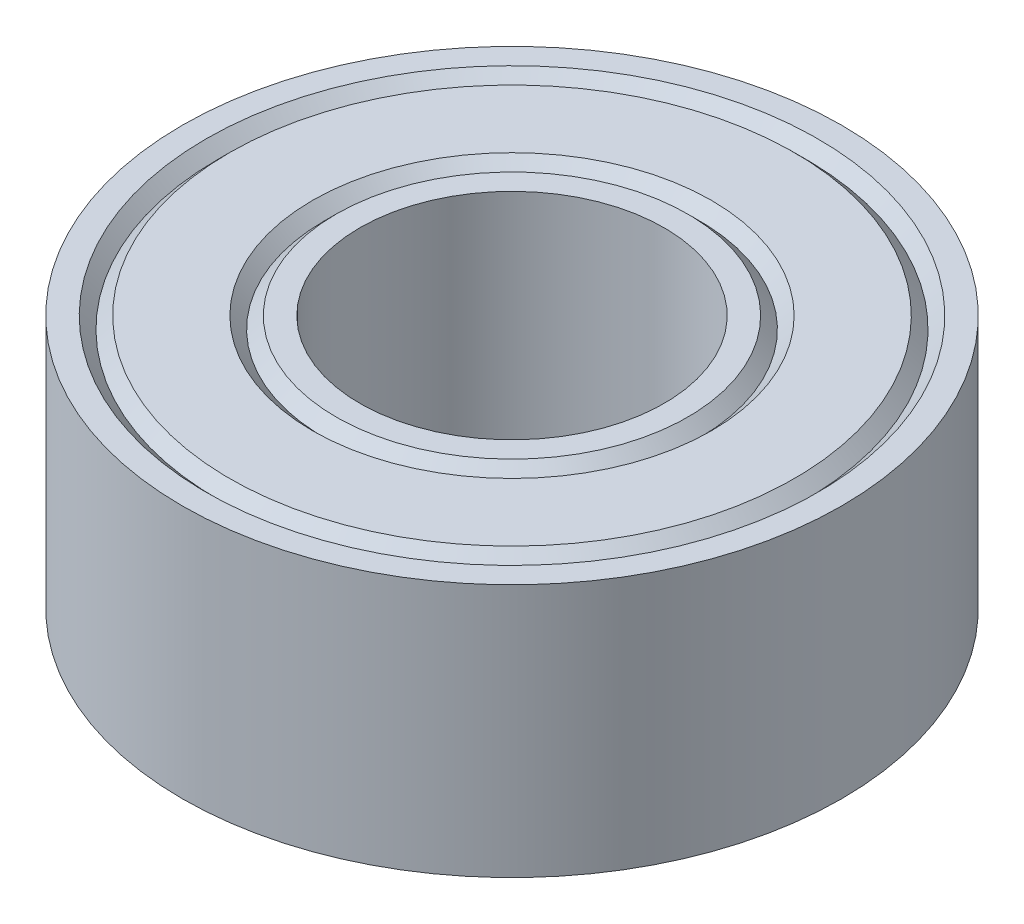
ISO-10303-21;
HEADER;
FILE_DESCRIPTION(('STEP AP214'),'2;1');
FILE_NAME('part.step','',(''),(''),'','','');
FILE_SCHEMA(('AUTOMOTIVE_DESIGN { 1 0 10303 214 1 1 1 1 }'));
ENDSEC;
DATA;
#1=APPLICATION_CONTEXT('core data for automotive mechanical design processes');
#2=APPLICATION_PROTOCOL_DEFINITION('international standard','automotive_design',2000,#1);
#3=PRODUCT_CONTEXT('',#1,'mechanical');
#4=PRODUCT('Part','Part','',(#3));
#5=PRODUCT_RELATED_PRODUCT_CATEGORY('part','',(#4));
#6=PRODUCT_DEFINITION_FORMATION('','',#4);
#7=PRODUCT_DEFINITION_CONTEXT('part definition',#1,'design');
#8=PRODUCT_DEFINITION('design','',#6,#7);
#9=PRODUCT_DEFINITION_SHAPE('','',#8);
#10=(LENGTH_UNIT() NAMED_UNIT(*) SI_UNIT(.MILLI.,.METRE.));
#11=(NAMED_UNIT(*) PLANE_ANGLE_UNIT() SI_UNIT($,.RADIAN.));
#12=(NAMED_UNIT(*) SI_UNIT($,.STERADIAN.) SOLID_ANGLE_UNIT());
#13=UNCERTAINTY_MEASURE_WITH_UNIT(LENGTH_MEASURE(1.E-05),#10,'distance_accuracy_value','');
#14=(GEOMETRIC_REPRESENTATION_CONTEXT(3) GLOBAL_UNCERTAINTY_ASSIGNED_CONTEXT((#13)) GLOBAL_UNIT_ASSIGNED_CONTEXT((#10,
#11,#12)) REPRESENTATION_CONTEXT('',''));
#15=CARTESIAN_POINT('',(0.,0.,0.));
#16=DIRECTION('',(0.,0.,1.));
#17=DIRECTION('',(1.,0.,0.));
#18=AXIS2_PLACEMENT_3D('',#15,#16,#17);
#19=CARTESIAN_POINT('',(0.,2.5,0.));
#20=DIRECTION('',(0.,1.,0.));
#21=DIRECTION('',(-1.,0.,0.));
#22=AXIS2_PLACEMENT_3D('',#19,#20,#21);
#23=CYLINDRICAL_SURFACE('',#22,3.);
#24=CARTESIAN_POINT('',(0.,2.5,0.));
#25=DIRECTION('',(0.,1.,0.));
#26=DIRECTION('',(-1.,0.,0.));
#27=AXIS2_PLACEMENT_3D('',#24,#25,#26);
#28=CIRCLE('',#27,3.);
#29=CARTESIAN_POINT('',(-3.,2.5,0.));
#30=VERTEX_POINT('',#29);
#31=EDGE_CURVE('E83',#30,#30,#28,.T.);
#32=ORIENTED_EDGE('',*,*,#31,.T.);
#33=EDGE_LOOP('',(#32));
#34=FACE_BOUND('',#33,.T.);
#35=CARTESIAN_POINT('',(0.,-2.5,0.));
#36=DIRECTION('',(0.,1.,0.));
#37=DIRECTION('',(-1.,0.,0.));
#38=AXIS2_PLACEMENT_3D('',#35,#36,#37);
#39=CIRCLE('',#38,3.00000000000001);
#40=CARTESIAN_POINT('',(-3.,-2.5,0.));
#41=VERTEX_POINT('',#40);
#42=EDGE_CURVE('E10',#41,#41,#39,.T.);
#43=ORIENTED_EDGE('',*,*,#42,.F.);
#44=EDGE_LOOP('',(#43));
#45=FACE_BOUND('',#44,.T.);
#46=ADVANCED_FACE('F31',(#34,#45),#23,.F.);
#47=CARTESIAN_POINT('',(-3.,-2.5,0.));
#48=DIRECTION('',(0.,-1.,0.));
#49=DIRECTION('',(1.,0.,0.));
#50=AXIS2_PLACEMENT_3D('',#47,#48,#49);
#51=PLANE('',#50);
#52=ORIENTED_EDGE('',*,*,#42,.T.);
#53=EDGE_LOOP('',(#52));
#54=FACE_BOUND('',#53,.T.);
#55=CARTESIAN_POINT('',(0.,-2.5,0.));
#56=DIRECTION('',(0.,1.,0.));
#57=DIRECTION('',(-1.,0.,0.));
#58=AXIS2_PLACEMENT_3D('',#55,#56,#57);
#59=CIRCLE('',#58,3.46666666666667);
#60=CARTESIAN_POINT('',(-3.46666666666667,-2.5,0.));
#61=VERTEX_POINT('',#60);
#62=EDGE_CURVE('E37',#61,#61,#59,.T.);
#63=ORIENTED_EDGE('',*,*,#62,.F.);
#64=EDGE_LOOP('',(#63));
#65=FACE_BOUND('',#64,.T.);
#66=ADVANCED_FACE('F101',(#54,#65),#51,.T.);
#67=CARTESIAN_POINT('',(0.,-2.26666666666667,0.));
#68=DIRECTION('',(0.,1.,0.));
#69=DIRECTION('',(-1.,0.,0.));
#70=AXIS2_PLACEMENT_3D('',#67,#68,#69);
#71=CONICAL_SURFACE('',#70,3.70000000000001,0.785398163397456);
#72=ORIENTED_EDGE('',*,*,#62,.T.);
#73=EDGE_LOOP('',(#72));
#74=FACE_BOUND('',#73,.T.);
#75=CARTESIAN_POINT('',(0.,-2.26666666666667,0.));
#76=DIRECTION('',(0.,1.,0.));
#77=DIRECTION('',(-1.,0.,0.));
#78=AXIS2_PLACEMENT_3D('',#75,#76,#77);
#79=CIRCLE('',#78,3.70000000000001);
#80=CARTESIAN_POINT('',(-3.7,-2.26666666666667,0.));
#81=VERTEX_POINT('',#80);
#82=EDGE_CURVE('E41',#81,#81,#79,.T.);
#83=ORIENTED_EDGE('',*,*,#82,.F.);
#84=EDGE_LOOP('',(#83));
#85=FACE_BOUND('',#84,.T.);
#86=ADVANCED_FACE('F105',(#74,#85),#71,.T.);
#87=CARTESIAN_POINT('',(0.,-2.5,0.));
#88=DIRECTION('',(0.,-1.,0.));
#89=DIRECTION('',(1.,0.,0.));
#90=AXIS2_PLACEMENT_3D('',#87,#88,#89);
#91=CONICAL_SURFACE('',#90,3.93333333333334,0.785398163397449);
#92=ORIENTED_EDGE('',*,*,#82,.T.);
#93=EDGE_LOOP('',(#92));
#94=FACE_BOUND('',#93,.T.);
#95=CARTESIAN_POINT('',(0.,-2.5,0.));
#96=DIRECTION('',(0.,1.,0.));
#97=DIRECTION('',(-1.,0.,0.));
#98=AXIS2_PLACEMENT_3D('',#95,#96,#97);
#99=CIRCLE('',#98,3.93333333333334);
#100=CARTESIAN_POINT('',(-3.93333333333333,-2.5,0.));
#101=VERTEX_POINT('',#100);
#102=EDGE_CURVE('E45',#101,#101,#99,.T.);
#103=ORIENTED_EDGE('',*,*,#102,.F.);
#104=EDGE_LOOP('',(#103));
#105=FACE_BOUND('',#104,.T.);
#106=ADVANCED_FACE('F109',(#94,#105),#91,.F.);
#107=CARTESIAN_POINT('',(-3.93333333333333,-2.5,0.));
#108=DIRECTION('',(0.,-1.,0.));
#109=DIRECTION('',(1.,0.,0.));
#110=AXIS2_PLACEMENT_3D('',#107,#108,#109);
#111=PLANE('',#110);
#112=ORIENTED_EDGE('',*,*,#102,.T.);
#113=EDGE_LOOP('',(#112));
#114=FACE_BOUND('',#113,.T.);
#115=CARTESIAN_POINT('',(0.,-2.5,0.));
#116=DIRECTION('',(0.,1.,0.));
#117=DIRECTION('',(-1.,0.,0.));
#118=AXIS2_PLACEMENT_3D('',#115,#116,#117);
#119=CIRCLE('',#118,5.56666666666668);
#120=CARTESIAN_POINT('',(-5.56666666666667,-2.5,0.));
#121=VERTEX_POINT('',#120);
#122=EDGE_CURVE('E50',#121,#121,#119,.T.);
#123=ORIENTED_EDGE('',*,*,#122,.F.);
#124=EDGE_LOOP('',(#123));
#125=FACE_BOUND('',#124,.T.);
#126=ADVANCED_FACE('F115',(#114,#125),#111,.T.);
#127=CARTESIAN_POINT('',(0.,-2.26666666666666,0.));
#128=DIRECTION('',(0.,1.,0.));
#129=DIRECTION('',(-1.,0.,0.));
#130=AXIS2_PLACEMENT_3D('',#127,#128,#129);
#131=CONICAL_SURFACE('',#130,5.80000000000001,0.78539816339745);
#132=ORIENTED_EDGE('',*,*,#122,.T.);
#133=EDGE_LOOP('',(#132));
#134=FACE_BOUND('',#133,.T.);
#135=CARTESIAN_POINT('',(0.,-2.26666666666666,0.));
#136=DIRECTION('',(0.,1.,0.));
#137=DIRECTION('',(-1.,0.,0.));
#138=AXIS2_PLACEMENT_3D('',#135,#136,#137);
#139=CIRCLE('',#138,5.80000000000001);
#140=CARTESIAN_POINT('',(-5.8,-2.26666666666667,0.));
#141=VERTEX_POINT('',#140);
#142=EDGE_CURVE('E53',#141,#141,#139,.T.);
#143=ORIENTED_EDGE('',*,*,#142,.F.);
#144=EDGE_LOOP('',(#143));
#145=FACE_BOUND('',#144,.T.);
#146=ADVANCED_FACE('F119',(#134,#145),#131,.T.);
#147=CARTESIAN_POINT('',(0.,-2.49999999999999,0.));
#148=DIRECTION('',(0.,-1.,0.));
#149=DIRECTION('',(1.,0.,0.));
#150=AXIS2_PLACEMENT_3D('',#147,#148,#149);
#151=CONICAL_SURFACE('',#150,6.03333333333334,0.785398163397447);
#152=ORIENTED_EDGE('',*,*,#142,.T.);
#153=EDGE_LOOP('',(#152));
#154=FACE_BOUND('',#153,.T.);
#155=CARTESIAN_POINT('',(0.,-2.49999999999999,0.));
#156=DIRECTION('',(0.,1.,0.));
#157=DIRECTION('',(-1.,0.,0.));
#158=AXIS2_PLACEMENT_3D('',#155,#156,#157);
#159=CIRCLE('',#158,6.03333333333334);
#160=CARTESIAN_POINT('',(-6.03333333333333,-2.5,0.));
#161=VERTEX_POINT('',#160);
#162=EDGE_CURVE('E56',#161,#161,#159,.T.);
#163=ORIENTED_EDGE('',*,*,#162,.F.);
#164=EDGE_LOOP('',(#163));
#165=FACE_BOUND('',#164,.T.);
#166=ADVANCED_FACE('F123',(#154,#165),#151,.F.);
#167=CARTESIAN_POINT('',(-6.03333333333333,-2.5,0.));
#168=DIRECTION('',(0.,-1.,0.));
#169=DIRECTION('',(1.,0.,0.));
#170=AXIS2_PLACEMENT_3D('',#167,#168,#169);
#171=PLANE('',#170);
#172=ORIENTED_EDGE('',*,*,#162,.T.);
#173=EDGE_LOOP('',(#172));
#174=FACE_BOUND('',#173,.T.);
#175=CARTESIAN_POINT('',(0.,-2.49999999999999,0.));
#176=DIRECTION('',(0.,1.,0.));
#177=DIRECTION('',(-1.,0.,0.));
#178=AXIS2_PLACEMENT_3D('',#175,#176,#177);
#179=CIRCLE('',#178,6.50000000000001);
#180=CARTESIAN_POINT('',(-6.5,-2.5,0.));
#181=VERTEX_POINT('',#180);
#182=EDGE_CURVE('E59',#181,#181,#179,.T.);
#183=ORIENTED_EDGE('',*,*,#182,.F.);
#184=EDGE_LOOP('',(#183));
#185=FACE_BOUND('',#184,.T.);
#186=ADVANCED_FACE('F127',(#174,#185),#171,.T.);
#187=CARTESIAN_POINT('',(0.,2.5,0.));
#188=DIRECTION('',(0.,1.,0.));
#189=DIRECTION('',(-1.,0.,0.));
#190=AXIS2_PLACEMENT_3D('',#187,#188,#189);
#191=CYLINDRICAL_SURFACE('',#190,6.5);
#192=ORIENTED_EDGE('',*,*,#182,.T.);
#193=EDGE_LOOP('',(#192));
#194=FACE_BOUND('',#193,.T.);
#195=CARTESIAN_POINT('',(0.,2.50000000000001,0.));
#196=DIRECTION('',(0.,1.,0.));
#197=DIRECTION('',(-1.,0.,0.));
#198=AXIS2_PLACEMENT_3D('',#195,#196,#197);
#199=CIRCLE('',#198,6.5);
#200=CARTESIAN_POINT('',(-6.5,2.5,0.));
#201=VERTEX_POINT('',#200);
#202=EDGE_CURVE('E62',#201,#201,#199,.T.);
#203=ORIENTED_EDGE('',*,*,#202,.F.);
#204=EDGE_LOOP('',(#203));
#205=FACE_BOUND('',#204,.T.);
#206=ADVANCED_FACE('F131',(#194,#205),#191,.T.);
#207=CARTESIAN_POINT('',(-6.03333333333333,2.5,0.));
#208=DIRECTION('',(0.,1.,0.));
#209=DIRECTION('',(-1.,0.,0.));
#210=AXIS2_PLACEMENT_3D('',#207,#208,#209);
#211=PLANE('',#210);
#212=ORIENTED_EDGE('',*,*,#202,.T.);
#213=EDGE_LOOP('',(#212));
#214=FACE_BOUND('',#213,.T.);
#215=CARTESIAN_POINT('',(0.,2.50000000000001,0.));
#216=DIRECTION('',(0.,1.,0.));
#217=DIRECTION('',(-1.,0.,0.));
#218=AXIS2_PLACEMENT_3D('',#215,#216,#217);
#219=CIRCLE('',#218,6.03333333333333);
#220=CARTESIAN_POINT('',(-6.03333333333333,2.5,0.));
#221=VERTEX_POINT('',#220);
#222=EDGE_CURVE('E65',#221,#221,#219,.T.);
#223=ORIENTED_EDGE('',*,*,#222,.F.);
#224=EDGE_LOOP('',(#223));
#225=FACE_BOUND('',#224,.T.);
#226=ADVANCED_FACE('F135',(#214,#225),#211,.T.);
#227=CARTESIAN_POINT('',(0.,2.26666666666667,0.));
#228=DIRECTION('',(0.,1.,0.));
#229=DIRECTION('',(-1.,0.,0.));
#230=AXIS2_PLACEMENT_3D('',#227,#228,#229);
#231=CONICAL_SURFACE('',#230,5.80000000000001,0.78539816339744);
#232=ORIENTED_EDGE('',*,*,#222,.T.);
#233=EDGE_LOOP('',(#232));
#234=FACE_BOUND('',#233,.T.);
#235=CARTESIAN_POINT('',(0.,2.26666666666667,0.));
#236=DIRECTION('',(0.,1.,0.));
#237=DIRECTION('',(-1.,0.,0.));
#238=AXIS2_PLACEMENT_3D('',#235,#236,#237);
#239=CIRCLE('',#238,5.80000000000001);
#240=CARTESIAN_POINT('',(-5.8,2.26666666666667,0.));
#241=VERTEX_POINT('',#240);
#242=EDGE_CURVE('E68',#241,#241,#239,.T.);
#243=ORIENTED_EDGE('',*,*,#242,.F.);
#244=EDGE_LOOP('',(#243));
#245=FACE_BOUND('',#244,.T.);
#246=ADVANCED_FACE('F139',(#234,#245),#231,.F.);
#247=CARTESIAN_POINT('',(0.,2.50000000000001,0.));
#248=DIRECTION('',(0.,-1.,0.));
#249=DIRECTION('',(1.,0.,0.));
#250=AXIS2_PLACEMENT_3D('',#247,#248,#249);
#251=CONICAL_SURFACE('',#250,5.56666666666667,0.785398163397452);
#252=ORIENTED_EDGE('',*,*,#242,.T.);
#253=EDGE_LOOP('',(#252));
#254=FACE_BOUND('',#253,.T.);
#255=CARTESIAN_POINT('',(0.,2.50000000000001,0.));
#256=DIRECTION('',(0.,1.,0.));
#257=DIRECTION('',(-1.,0.,0.));
#258=AXIS2_PLACEMENT_3D('',#255,#256,#257);
#259=CIRCLE('',#258,5.56666666666667);
#260=CARTESIAN_POINT('',(-5.56666666666667,2.5,0.));
#261=VERTEX_POINT('',#260);
#262=EDGE_CURVE('E71',#261,#261,#259,.T.);
#263=ORIENTED_EDGE('',*,*,#262,.F.);
#264=EDGE_LOOP('',(#263));
#265=FACE_BOUND('',#264,.T.);
#266=ADVANCED_FACE('F143',(#254,#265),#251,.T.);
#267=CARTESIAN_POINT('',(-3.93333333333333,2.5,0.));
#268=DIRECTION('',(0.,1.,0.));
#269=DIRECTION('',(-1.,0.,0.));
#270=AXIS2_PLACEMENT_3D('',#267,#268,#269);
#271=PLANE('',#270);
#272=ORIENTED_EDGE('',*,*,#262,.T.);
#273=EDGE_LOOP('',(#272));
#274=FACE_BOUND('',#273,.T.);
#275=CARTESIAN_POINT('',(0.,2.5,0.));
#276=DIRECTION('',(0.,1.,0.));
#277=DIRECTION('',(-1.,0.,0.));
#278=AXIS2_PLACEMENT_3D('',#275,#276,#277);
#279=CIRCLE('',#278,3.93333333333333);
#280=CARTESIAN_POINT('',(-3.93333333333333,2.5,0.));
#281=VERTEX_POINT('',#280);
#282=EDGE_CURVE('E74',#281,#281,#279,.T.);
#283=ORIENTED_EDGE('',*,*,#282,.F.);
#284=EDGE_LOOP('',(#283));
#285=FACE_BOUND('',#284,.T.);
#286=ADVANCED_FACE('F147',(#274,#285),#271,.T.);
#287=CARTESIAN_POINT('',(0.,2.26666666666667,0.));
#288=DIRECTION('',(0.,1.,0.));
#289=DIRECTION('',(-1.,0.,0.));
#290=AXIS2_PLACEMENT_3D('',#287,#288,#289);
#291=CONICAL_SURFACE('',#290,3.7,0.785398163397447);
#292=ORIENTED_EDGE('',*,*,#282,.T.);
#293=EDGE_LOOP('',(#292));
#294=FACE_BOUND('',#293,.T.);
#295=CARTESIAN_POINT('',(0.,2.26666666666667,0.));
#296=DIRECTION('',(0.,1.,0.));
#297=DIRECTION('',(-1.,0.,0.));
#298=AXIS2_PLACEMENT_3D('',#295,#296,#297);
#299=CIRCLE('',#298,3.7);
#300=CARTESIAN_POINT('',(-3.7,2.26666666666667,0.));
#301=VERTEX_POINT('',#300);
#302=EDGE_CURVE('E77',#301,#301,#299,.T.);
#303=ORIENTED_EDGE('',*,*,#302,.F.);
#304=EDGE_LOOP('',(#303));
#305=FACE_BOUND('',#304,.T.);
#306=ADVANCED_FACE('F97',(#294,#305),#291,.F.);
#307=CARTESIAN_POINT('',(0.,2.5,0.));
#308=DIRECTION('',(0.,-1.,0.));
#309=DIRECTION('',(1.,0.,0.));
#310=AXIS2_PLACEMENT_3D('',#307,#308,#309);
#311=CONICAL_SURFACE('',#310,3.46666666666667,0.785398163397453);
#312=ORIENTED_EDGE('',*,*,#302,.T.);
#313=EDGE_LOOP('',(#312));
#314=FACE_BOUND('',#313,.T.);
#315=CARTESIAN_POINT('',(0.,2.5,0.));
#316=DIRECTION('',(0.,1.,0.));
#317=DIRECTION('',(-1.,0.,0.));
#318=AXIS2_PLACEMENT_3D('',#315,#316,#317);
#319=CIRCLE('',#318,3.46666666666667);
#320=CARTESIAN_POINT('',(-3.46666666666667,2.5,0.));
#321=VERTEX_POINT('',#320);
#322=EDGE_CURVE('E80',#321,#321,#319,.T.);
#323=ORIENTED_EDGE('',*,*,#322,.F.);
#324=EDGE_LOOP('',(#323));
#325=FACE_BOUND('',#324,.T.);
#326=ADVANCED_FACE('F91',(#314,#325),#311,.T.);
#327=CARTESIAN_POINT('',(-3.,2.5,0.));
#328=DIRECTION('',(0.,1.,0.));
#329=DIRECTION('',(-1.,0.,0.));
#330=AXIS2_PLACEMENT_3D('',#327,#328,#329);
#331=PLANE('',#330);
#332=ORIENTED_EDGE('',*,*,#322,.T.);
#333=EDGE_LOOP('',(#332));
#334=FACE_BOUND('',#333,.T.);
#335=ORIENTED_EDGE('',*,*,#31,.F.);
#336=EDGE_LOOP('',(#335));
#337=FACE_BOUND('',#336,.T.);
#338=ADVANCED_FACE('F89',(#334,#337),#331,.T.);
#339=CLOSED_SHELL('',(#46,#66,#86,#106,#126,#146,#166,#186,#206,#226,#246,#266,#286,#306,#326,#338));
#340=MANIFOLD_SOLID_BREP('B2',#339);
#341=ADVANCED_BREP_SHAPE_REPRESENTATION('',(#18,#340),#14);
#342=SHAPE_DEFINITION_REPRESENTATION(#9,#341);
ENDSEC;
END-ISO-10303-21;
